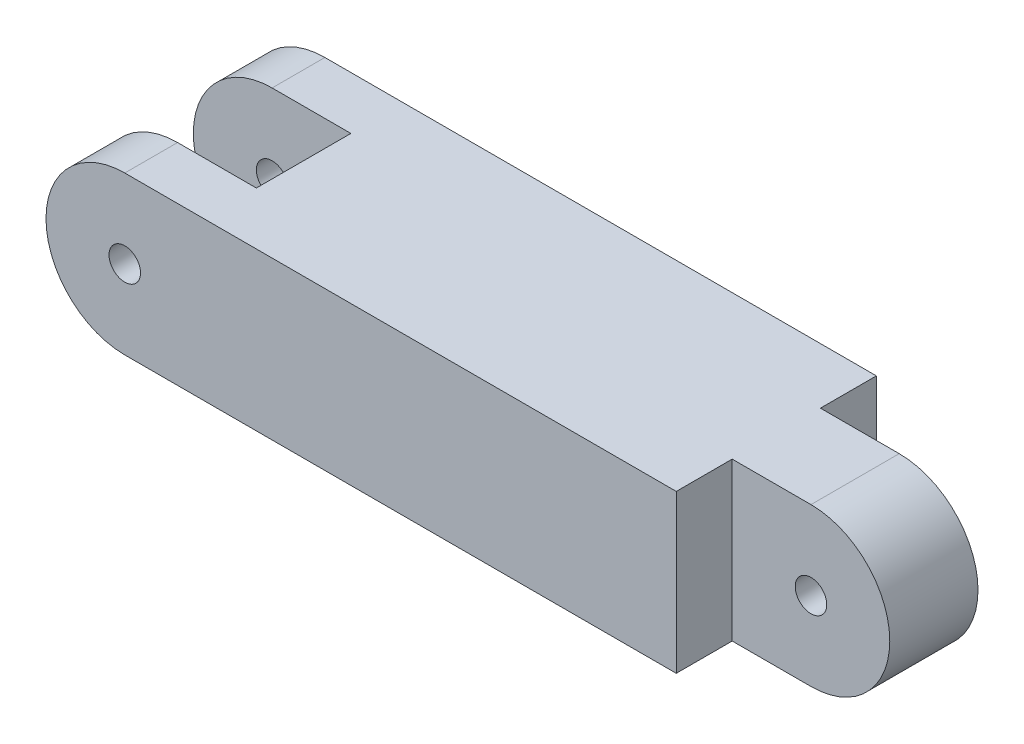
ISO-10303-21;
HEADER;
FILE_DESCRIPTION(('STEP AP214'),'2;1');
FILE_NAME('part.step','',(''),(''),'','','');
FILE_SCHEMA(('AUTOMOTIVE_DESIGN { 1 0 10303 214 1 1 1 1 }'));
ENDSEC;
DATA;
#1=APPLICATION_CONTEXT('core data for automotive mechanical design processes');
#2=APPLICATION_PROTOCOL_DEFINITION('international standard','automotive_design',2000,#1);
#3=PRODUCT_CONTEXT('',#1,'mechanical');
#4=PRODUCT('Part','Part','',(#3));
#5=PRODUCT_RELATED_PRODUCT_CATEGORY('part','',(#4));
#6=PRODUCT_DEFINITION_FORMATION('','',#4);
#7=PRODUCT_DEFINITION_CONTEXT('part definition',#1,'design');
#8=PRODUCT_DEFINITION('design','',#6,#7);
#9=PRODUCT_DEFINITION_SHAPE('','',#8);
#10=(LENGTH_UNIT() NAMED_UNIT(*) SI_UNIT(.MILLI.,.METRE.));
#11=(NAMED_UNIT(*) PLANE_ANGLE_UNIT() SI_UNIT($,.RADIAN.));
#12=(NAMED_UNIT(*) SI_UNIT($,.STERADIAN.) SOLID_ANGLE_UNIT());
#13=UNCERTAINTY_MEASURE_WITH_UNIT(LENGTH_MEASURE(1.E-05),#10,'distance_accuracy_value','');
#14=(GEOMETRIC_REPRESENTATION_CONTEXT(3) GLOBAL_UNCERTAINTY_ASSIGNED_CONTEXT((#13)) GLOBAL_UNIT_ASSIGNED_CONTEXT((#10,
#11,#12)) REPRESENTATION_CONTEXT('',''));
#15=CARTESIAN_POINT('',(0.,0.,0.));
#16=DIRECTION('',(0.,0.,1.));
#17=DIRECTION('',(1.,0.,0.));
#18=AXIS2_PLACEMENT_3D('',#15,#16,#17);
#19=CARTESIAN_POINT('',(0.,-5.,6.35));
#20=DIRECTION('',(0.,1.,0.));
#21=DIRECTION('',(0.,0.,1.));
#22=AXIS2_PLACEMENT_3D('',#19,#20,#21);
#23=PLANE('',#22);
#24=DIRECTION('',(1.,0.,0.));
#25=VECTOR('',#24,1.);
#26=CARTESIAN_POINT('',(-399980.,-4.99999999999545,-3.));
#27=LINE('',#26,#25);
#28=CARTESIAN_POINT('',(0.,-4.99999999999545,-3.));
#29=VERTEX_POINT('',#28);
#30=CARTESIAN_POINT('',(4.99999999999545,-4.99999999999545,-3.));
#31=VERTEX_POINT('',#30);
#32=EDGE_CURVE('E144',#29,#31,#27,.T.);
#33=ORIENTED_EDGE('',*,*,#32,.F.);
#34=DIRECTION('',(0.,0.,-1.));
#35=VECTOR('',#34,1.);
#36=CARTESIAN_POINT('',(0.,-5.,6.35));
#37=LINE('',#36,#35);
#38=CARTESIAN_POINT('',(0.,-5.,-6.35));
#39=VERTEX_POINT('',#38);
#40=EDGE_CURVE('E50',#29,#39,#37,.T.);
#41=ORIENTED_EDGE('',*,*,#40,.T.);
#42=DIRECTION('',(1.,0.,0.));
#43=VECTOR('',#42,1.);
#44=CARTESIAN_POINT('',(0.,-5.,-6.35));
#45=LINE('',#44,#43);
#46=CARTESIAN_POINT('',(35.,-5.,-6.35));
#47=VERTEX_POINT('',#46);
#48=EDGE_CURVE('E228',#39,#47,#45,.T.);
#49=ORIENTED_EDGE('',*,*,#48,.T.);
#50=DIRECTION('',(0.,0.,-1.));
#51=VECTOR('',#50,1.);
#52=CARTESIAN_POINT('',(35.,-5.,14.142135623731));
#53=LINE('',#52,#51);
#54=CARTESIAN_POINT('',(35.,-5.,-2.8));
#55=VERTEX_POINT('',#54);
#56=EDGE_CURVE('E66',#55,#47,#53,.T.);
#57=ORIENTED_EDGE('',*,*,#56,.F.);
#58=DIRECTION('',(1.,0.,0.));
#59=VECTOR('',#58,1.);
#60=CARTESIAN_POINT('',(35.,-5.,-2.8));
#61=LINE('',#60,#59);
#62=CARTESIAN_POINT('',(40.,-5.,-2.8));
#63=VERTEX_POINT('',#62);
#64=EDGE_CURVE('E174',#55,#63,#61,.T.);
#65=ORIENTED_EDGE('',*,*,#64,.T.);
#66=DIRECTION('',(0.,0.,-1.));
#67=VECTOR('',#66,1.);
#68=CARTESIAN_POINT('',(40.,-5.,6.35));
#69=LINE('',#68,#67);
#70=CARTESIAN_POINT('',(40.,-5.,2.8));
#71=VERTEX_POINT('',#70);
#72=EDGE_CURVE('E238',#71,#63,#69,.T.);
#73=ORIENTED_EDGE('',*,*,#72,.F.);
#74=DIRECTION('',(-1.,0.,0.));
#75=VECTOR('',#74,1.);
#76=CARTESIAN_POINT('',(35.,-5.,2.8));
#77=LINE('',#76,#75);
#78=CARTESIAN_POINT('',(35.,-5.,2.8));
#79=VERTEX_POINT('',#78);
#80=EDGE_CURVE('E192',#71,#79,#77,.T.);
#81=ORIENTED_EDGE('',*,*,#80,.T.);
#82=DIRECTION('',(0.,0.,1.));
#83=VECTOR('',#82,1.);
#84=CARTESIAN_POINT('',(35.,-5.,-14.142135623731));
#85=LINE('',#84,#83);
#86=CARTESIAN_POINT('',(35.,-5.,6.35));
#87=VERTEX_POINT('',#86);
#88=EDGE_CURVE('E196',#79,#87,#85,.T.);
#89=ORIENTED_EDGE('',*,*,#88,.T.);
#90=DIRECTION('',(1.,0.,0.));
#91=VECTOR('',#90,1.);
#92=CARTESIAN_POINT('',(0.,-5.,6.35));
#93=LINE('',#92,#91);
#94=CARTESIAN_POINT('',(0.,-5.,6.35));
#95=VERTEX_POINT('',#94);
#96=EDGE_CURVE('E220',#95,#87,#93,.T.);
#97=ORIENTED_EDGE('',*,*,#96,.F.);
#98=CARTESIAN_POINT('',(0.,-5.,3.));
#99=VERTEX_POINT('',#98);
#100=EDGE_CURVE('E12',#95,#99,#37,.T.);
#101=ORIENTED_EDGE('',*,*,#100,.T.);
#102=DIRECTION('',(1.,0.,0.));
#103=VECTOR('',#102,1.);
#104=CARTESIAN_POINT('',(-399980.,-4.99999999999545,3.));
#105=LINE('',#104,#103);
#106=CARTESIAN_POINT('',(4.99999999999545,-4.99999999999545,3.));
#107=VERTEX_POINT('',#106);
#108=EDGE_CURVE('E58',#99,#107,#105,.T.);
#109=ORIENTED_EDGE('',*,*,#108,.T.);
#110=DIRECTION('',(0.,0.,1.));
#111=VECTOR('',#110,1.);
#112=CARTESIAN_POINT('',(4.99999999999545,-4.99999999999545,-3.));
#113=LINE('',#112,#111);
#114=EDGE_CURVE('E143',#31,#107,#113,.T.);
#115=ORIENTED_EDGE('',*,*,#114,.F.);
#116=EDGE_LOOP('',(#33,#41,#49,#57,#65,#73,#81,#89,#97,#101,#109,#115));
#117=FACE_BOUND('',#116,.T.);
#118=ADVANCED_FACE('F41',(#117),#23,.F.);
#119=CARTESIAN_POINT('',(0.,5.,6.35));
#120=DIRECTION('',(0.,-1.,0.));
#121=DIRECTION('',(0.,0.,-1.));
#122=AXIS2_PLACEMENT_3D('',#119,#120,#121);
#123=PLANE('',#122);
#124=DIRECTION('',(-1.,0.,0.));
#125=VECTOR('',#124,1.);
#126=CARTESIAN_POINT('',(-399980.,5.00000000056389,-3.));
#127=LINE('',#126,#125);
#128=CARTESIAN_POINT('',(4.99999999999545,5.0000000000088,-3.));
#129=VERTEX_POINT('',#128);
#130=CARTESIAN_POINT('',(0.,5.,-3.));
#131=VERTEX_POINT('',#130);
#132=EDGE_CURVE('E149',#129,#131,#127,.T.);
#133=ORIENTED_EDGE('',*,*,#132,.F.);
#134=DIRECTION('',(0.,0.,1.));
#135=VECTOR('',#134,1.);
#136=CARTESIAN_POINT('',(4.99999999999545,5.0000000000088,-3.));
#137=LINE('',#136,#135);
#138=CARTESIAN_POINT('',(4.99999999999545,5.0000000000088,3.));
#139=VERTEX_POINT('',#138);
#140=EDGE_CURVE('E134',#129,#139,#137,.T.);
#141=ORIENTED_EDGE('',*,*,#140,.T.);
#142=DIRECTION('',(-1.,0.,0.));
#143=VECTOR('',#142,1.);
#144=CARTESIAN_POINT('',(-399980.,5.00000000056389,3.));
#145=LINE('',#144,#143);
#146=CARTESIAN_POINT('',(0.,5.,3.));
#147=VERTEX_POINT('',#146);
#148=EDGE_CURVE('E164',#139,#147,#145,.T.);
#149=ORIENTED_EDGE('',*,*,#148,.T.);
#150=DIRECTION('',(0.,0.,-1.));
#151=VECTOR('',#150,1.);
#152=CARTESIAN_POINT('',(0.,5.,6.35));
#153=LINE('',#152,#151);
#154=CARTESIAN_POINT('',(0.,5.,6.35));
#155=VERTEX_POINT('',#154);
#156=EDGE_CURVE('E232',#155,#147,#153,.T.);
#157=ORIENTED_EDGE('',*,*,#156,.F.);
#158=DIRECTION('',(-1.,0.,0.));
#159=VECTOR('',#158,1.);
#160=CARTESIAN_POINT('',(0.,5.,6.35));
#161=LINE('',#160,#159);
#162=CARTESIAN_POINT('',(35.,5.,6.35));
#163=VERTEX_POINT('',#162);
#164=EDGE_CURVE('E224',#163,#155,#161,.T.);
#165=ORIENTED_EDGE('',*,*,#164,.F.);
#166=DIRECTION('',(0.,0.,1.));
#167=VECTOR('',#166,1.);
#168=CARTESIAN_POINT('',(35.,5.,-14.142135623731));
#169=LINE('',#168,#167);
#170=CARTESIAN_POINT('',(35.,5.,2.8));
#171=VERTEX_POINT('',#170);
#172=EDGE_CURVE('E204',#171,#163,#169,.T.);
#173=ORIENTED_EDGE('',*,*,#172,.F.);
#174=DIRECTION('',(1.,0.,0.));
#175=VECTOR('',#174,1.);
#176=CARTESIAN_POINT('',(40.,5.,2.8));
#177=LINE('',#176,#175);
#178=CARTESIAN_POINT('',(40.,5.,2.8));
#179=VERTEX_POINT('',#178);
#180=EDGE_CURVE('E199',#171,#179,#177,.T.);
#181=ORIENTED_EDGE('',*,*,#180,.T.);
#182=DIRECTION('',(0.,0.,-1.));
#183=VECTOR('',#182,1.);
#184=CARTESIAN_POINT('',(40.,5.,6.35));
#185=LINE('',#184,#183);
#186=CARTESIAN_POINT('',(40.,5.,-2.8));
#187=VERTEX_POINT('',#186);
#188=EDGE_CURVE('E235',#179,#187,#185,.T.);
#189=ORIENTED_EDGE('',*,*,#188,.T.);
#190=DIRECTION('',(-1.,0.,0.));
#191=VECTOR('',#190,1.);
#192=CARTESIAN_POINT('',(40.,5.,-2.8));
#193=LINE('',#192,#191);
#194=CARTESIAN_POINT('',(35.,5.,-2.8));
#195=VERTEX_POINT('',#194);
#196=EDGE_CURVE('E180',#187,#195,#193,.T.);
#197=ORIENTED_EDGE('',*,*,#196,.T.);
#198=DIRECTION('',(0.,0.,-1.));
#199=VECTOR('',#198,1.);
#200=CARTESIAN_POINT('',(35.,5.,14.142135623731));
#201=LINE('',#200,#199);
#202=CARTESIAN_POINT('',(35.,5.,-6.35));
#203=VERTEX_POINT('',#202);
#204=EDGE_CURVE('E173',#195,#203,#201,.T.);
#205=ORIENTED_EDGE('',*,*,#204,.T.);
#206=DIRECTION('',(-1.,0.,0.));
#207=VECTOR('',#206,1.);
#208=CARTESIAN_POINT('',(0.,5.,-6.35));
#209=LINE('',#208,#207);
#210=CARTESIAN_POINT('',(0.,5.,-6.35));
#211=VERTEX_POINT('',#210);
#212=EDGE_CURVE('E221',#203,#211,#209,.T.);
#213=ORIENTED_EDGE('',*,*,#212,.T.);
#214=EDGE_CURVE('E157',#131,#211,#153,.T.);
#215=ORIENTED_EDGE('',*,*,#214,.F.);
#216=EDGE_LOOP('',(#133,#141,#149,#157,#165,#173,#181,#189,#197,#205,#213,#215));
#217=FACE_BOUND('',#216,.T.);
#218=ADVANCED_FACE('F155',(#217),#123,.F.);
#219=CARTESIAN_POINT('',(0.,0.,6.35));
#220=DIRECTION('',(0.,0.,-1.));
#221=DIRECTION('',(-1.,0.,0.));
#222=AXIS2_PLACEMENT_3D('',#219,#220,#221);
#223=CYLINDRICAL_SURFACE('',#222,5.);
#224=CARTESIAN_POINT('',(0.,0.,-3.));
#225=DIRECTION('',(0.,0.,1.));
#226=DIRECTION('',(1.,0.,0.));
#227=AXIS2_PLACEMENT_3D('',#224,#225,#226);
#228=CIRCLE('',#227,5.);
#229=EDGE_CURVE('E158',#131,#29,#228,.T.);
#230=ORIENTED_EDGE('',*,*,#229,.F.);
#231=ORIENTED_EDGE('',*,*,#214,.T.);
#232=CARTESIAN_POINT('',(0.,0.,-6.35));
#233=DIRECTION('',(0.,0.,1.));
#234=DIRECTION('',(1.,0.,0.));
#235=AXIS2_PLACEMENT_3D('',#232,#233,#234);
#236=CIRCLE('',#235,5.);
#237=EDGE_CURVE('E216',#211,#39,#236,.T.);
#238=ORIENTED_EDGE('',*,*,#237,.T.);
#239=ORIENTED_EDGE('',*,*,#40,.F.);
#240=EDGE_LOOP('',(#230,#231,#238,#239));
#241=FACE_BOUND('',#240,.T.);
#242=ADVANCED_FACE('F251',(#241),#223,.T.);
#243=CARTESIAN_POINT('',(0.,0.,-9.17842712474619));
#244=DIRECTION('',(0.,0.,1.));
#245=DIRECTION('',(1.,0.,0.));
#246=AXIS2_PLACEMENT_3D('',#243,#244,#245);
#247=CYLINDRICAL_SURFACE('',#246,1.);
#248=CARTESIAN_POINT('',(0.,0.,-6.35));
#249=DIRECTION('',(0.,0.,1.));
#250=DIRECTION('',(1.,0.,0.));
#251=AXIS2_PLACEMENT_3D('',#248,#249,#250);
#252=CIRCLE('',#251,1.);
#253=CARTESIAN_POINT('',(1.,0.,-6.35));
#254=VERTEX_POINT('',#253);
#255=EDGE_CURVE('E210',#254,#254,#252,.F.);
#256=ORIENTED_EDGE('',*,*,#255,.T.);
#257=EDGE_LOOP('',(#256));
#258=FACE_BOUND('',#257,.T.);
#259=CARTESIAN_POINT('',(0.,0.,-3.));
#260=DIRECTION('',(0.,0.,1.));
#261=DIRECTION('',(1.,0.,0.));
#262=AXIS2_PLACEMENT_3D('',#259,#260,#261);
#263=CIRCLE('',#262,1.);
#264=CARTESIAN_POINT('',(1.,0.,-3.));
#265=VERTEX_POINT('',#264);
#266=EDGE_CURVE('E45',#265,#265,#263,.F.);
#267=ORIENTED_EDGE('',*,*,#266,.F.);
#268=EDGE_LOOP('',(#267));
#269=FACE_BOUND('',#268,.T.);
#270=ADVANCED_FACE('F248',(#258,#269),#247,.F.);
#271=CARTESIAN_POINT('',(0.,0.,-6.35));
#272=DIRECTION('',(0.,0.,1.));
#273=DIRECTION('',(1.,0.,0.));
#274=AXIS2_PLACEMENT_3D('',#271,#272,#273);
#275=PLANE('',#274);
#276=ORIENTED_EDGE('',*,*,#255,.F.);
#277=EDGE_LOOP('',(#276));
#278=FACE_BOUND('',#277,.T.);
#279=DIRECTION('',(0.,-1.,0.));
#280=VECTOR('',#279,1.);
#281=CARTESIAN_POINT('',(35.,5.,-6.35));
#282=LINE('',#281,#280);
#283=EDGE_CURVE('E171',#203,#47,#282,.T.);
#284=ORIENTED_EDGE('',*,*,#283,.T.);
#285=ORIENTED_EDGE('',*,*,#48,.F.);
#286=ORIENTED_EDGE('',*,*,#237,.F.);
#287=ORIENTED_EDGE('',*,*,#212,.F.);
#288=EDGE_LOOP('',(#284,#285,#286,#287));
#289=FACE_BOUND('',#288,.T.);
#290=ADVANCED_FACE('F250',(#278,#289),#275,.F.);
#291=CARTESIAN_POINT('',(40.,0.,6.35));
#292=DIRECTION('',(0.,0.,-1.));
#293=DIRECTION('',(-1.,0.,0.));
#294=AXIS2_PLACEMENT_3D('',#291,#292,#293);
#295=CYLINDRICAL_SURFACE('',#294,5.);
#296=ORIENTED_EDGE('',*,*,#72,.T.);
#297=CARTESIAN_POINT('',(40.,0.,-2.8));
#298=DIRECTION('',(0.,0.,1.));
#299=DIRECTION('',(1.,0.,0.));
#300=AXIS2_PLACEMENT_3D('',#297,#298,#299);
#301=CIRCLE('',#300,5.);
#302=EDGE_CURVE('E183',#63,#187,#301,.T.);
#303=ORIENTED_EDGE('',*,*,#302,.T.);
#304=ORIENTED_EDGE('',*,*,#188,.F.);
#305=CARTESIAN_POINT('',(40.,0.,2.8));
#306=DIRECTION('',(0.,0.,1.));
#307=DIRECTION('',(1.,0.,0.));
#308=AXIS2_PLACEMENT_3D('',#305,#306,#307);
#309=CIRCLE('',#308,5.);
#310=EDGE_CURVE('E195',#179,#71,#309,.F.);
#311=ORIENTED_EDGE('',*,*,#310,.T.);
#312=EDGE_LOOP('',(#296,#303,#304,#311));
#313=FACE_BOUND('',#312,.T.);
#314=ADVANCED_FACE('F260',(#313),#295,.T.);
#315=CARTESIAN_POINT('',(40.,0.,-9.17842712474619));
#316=DIRECTION('',(0.,0.,1.));
#317=DIRECTION('',(1.,0.,0.));
#318=AXIS2_PLACEMENT_3D('',#315,#316,#317);
#319=CYLINDRICAL_SURFACE('',#318,0.999999999999998);
#320=CARTESIAN_POINT('',(40.,0.,-2.8));
#321=DIRECTION('',(0.,0.,1.));
#322=DIRECTION('',(1.,0.,0.));
#323=AXIS2_PLACEMENT_3D('',#320,#321,#322);
#324=CIRCLE('',#323,0.999999999999998);
#325=CARTESIAN_POINT('',(41.,0.,-2.8));
#326=VERTEX_POINT('',#325);
#327=EDGE_CURVE('E177',#326,#326,#324,.F.);
#328=ORIENTED_EDGE('',*,*,#327,.T.);
#329=EDGE_LOOP('',(#328));
#330=FACE_BOUND('',#329,.T.);
#331=CARTESIAN_POINT('',(40.,0.,2.8));
#332=DIRECTION('',(0.,0.,1.));
#333=DIRECTION('',(1.,0.,0.));
#334=AXIS2_PLACEMENT_3D('',#331,#332,#333);
#335=CIRCLE('',#334,0.999999999999998);
#336=CARTESIAN_POINT('',(41.,0.,2.8));
#337=VERTEX_POINT('',#336);
#338=EDGE_CURVE('E209',#337,#337,#335,.F.);
#339=ORIENTED_EDGE('',*,*,#338,.F.);
#340=EDGE_LOOP('',(#339));
#341=FACE_BOUND('',#340,.T.);
#342=ADVANCED_FACE('F278',(#330,#341),#319,.F.);
#343=ORIENTED_EDGE('',*,*,#156,.T.);
#344=CARTESIAN_POINT('',(0.,0.,3.));
#345=DIRECTION('',(0.,0.,1.));
#346=DIRECTION('',(1.,0.,0.));
#347=AXIS2_PLACEMENT_3D('',#344,#345,#346);
#348=CIRCLE('',#347,5.);
#349=EDGE_CURVE('E166',#147,#99,#348,.T.);
#350=ORIENTED_EDGE('',*,*,#349,.T.);
#351=ORIENTED_EDGE('',*,*,#100,.F.);
#352=CARTESIAN_POINT('',(0.,0.,6.35));
#353=DIRECTION('',(0.,0.,1.));
#354=DIRECTION('',(1.,0.,0.));
#355=AXIS2_PLACEMENT_3D('',#352,#353,#354);
#356=CIRCLE('',#355,5.);
#357=EDGE_CURVE('E217',#155,#95,#356,.T.);
#358=ORIENTED_EDGE('',*,*,#357,.F.);
#359=EDGE_LOOP('',(#343,#350,#351,#358));
#360=FACE_BOUND('',#359,.T.);
#361=ADVANCED_FACE('F43',(#360),#223,.T.);
#362=CARTESIAN_POINT('',(0.,0.,6.35));
#363=DIRECTION('',(0.,0.,1.));
#364=DIRECTION('',(1.,0.,0.));
#365=AXIS2_PLACEMENT_3D('',#362,#363,#364);
#366=PLANE('',#365);
#367=DIRECTION('',(0.,-1.,0.));
#368=VECTOR('',#367,1.);
#369=CARTESIAN_POINT('',(35.,5.,6.35));
#370=LINE('',#369,#368);
#371=EDGE_CURVE('E191',#163,#87,#370,.T.);
#372=ORIENTED_EDGE('',*,*,#371,.F.);
#373=ORIENTED_EDGE('',*,*,#164,.T.);
#374=ORIENTED_EDGE('',*,*,#357,.T.);
#375=ORIENTED_EDGE('',*,*,#96,.T.);
#376=EDGE_LOOP('',(#372,#373,#374,#375));
#377=FACE_BOUND('',#376,.T.);
#378=CARTESIAN_POINT('',(0.,0.,6.35));
#379=DIRECTION('',(0.,0.,1.));
#380=DIRECTION('',(1.,0.,0.));
#381=AXIS2_PLACEMENT_3D('',#378,#379,#380);
#382=CIRCLE('',#381,1.);
#383=CARTESIAN_POINT('',(1.,0.,6.35));
#384=VERTEX_POINT('',#383);
#385=EDGE_CURVE('E213',#384,#384,#382,.T.);
#386=ORIENTED_EDGE('',*,*,#385,.F.);
#387=EDGE_LOOP('',(#386));
#388=FACE_BOUND('',#387,.T.);
#389=ADVANCED_FACE('F268',(#377,#388),#366,.T.);
#390=CARTESIAN_POINT('',(0.,0.,3.));
#391=DIRECTION('',(0.,0.,1.));
#392=DIRECTION('',(1.,0.,0.));
#393=AXIS2_PLACEMENT_3D('',#390,#391,#392);
#394=CIRCLE('',#393,1.);
#395=CARTESIAN_POINT('',(1.,0.,3.));
#396=VERTEX_POINT('',#395);
#397=EDGE_CURVE('E169',#396,#396,#394,.F.);
#398=ORIENTED_EDGE('',*,*,#397,.T.);
#399=EDGE_LOOP('',(#398));
#400=FACE_BOUND('',#399,.T.);
#401=ORIENTED_EDGE('',*,*,#385,.T.);
#402=EDGE_LOOP('',(#401));
#403=FACE_BOUND('',#402,.T.);
#404=ADVANCED_FACE('F254',(#400,#403),#247,.F.);
#405=CARTESIAN_POINT('',(0.,0.,2.8));
#406=DIRECTION('',(0.,0.,1.));
#407=DIRECTION('',(1.,0.,0.));
#408=AXIS2_PLACEMENT_3D('',#405,#406,#407);
#409=PLANE('',#408);
#410=ORIENTED_EDGE('',*,*,#180,.F.);
#411=DIRECTION('',(0.,1.,0.));
#412=VECTOR('',#411,1.);
#413=CARTESIAN_POINT('',(35.,5.,2.8));
#414=LINE('',#413,#412);
#415=EDGE_CURVE('E202',#79,#171,#414,.T.);
#416=ORIENTED_EDGE('',*,*,#415,.F.);
#417=ORIENTED_EDGE('',*,*,#80,.F.);
#418=ORIENTED_EDGE('',*,*,#310,.F.);
#419=EDGE_LOOP('',(#410,#416,#417,#418));
#420=FACE_BOUND('',#419,.T.);
#421=ORIENTED_EDGE('',*,*,#338,.T.);
#422=EDGE_LOOP('',(#421));
#423=FACE_BOUND('',#422,.T.);
#424=ADVANCED_FACE('F267',(#420,#423),#409,.T.);
#425=CARTESIAN_POINT('',(35.,5.,-14.142135623731));
#426=DIRECTION('',(-1.,0.,0.));
#427=DIRECTION('',(0.,0.,1.));
#428=AXIS2_PLACEMENT_3D('',#425,#426,#427);
#429=PLANE('',#428);
#430=ORIENTED_EDGE('',*,*,#415,.T.);
#431=ORIENTED_EDGE('',*,*,#172,.T.);
#432=ORIENTED_EDGE('',*,*,#371,.T.);
#433=ORIENTED_EDGE('',*,*,#88,.F.);
#434=EDGE_LOOP('',(#430,#431,#432,#433));
#435=FACE_BOUND('',#434,.T.);
#436=ADVANCED_FACE('F298',(#435),#429,.F.);
#437=CARTESIAN_POINT('',(0.,0.,-2.8));
#438=DIRECTION('',(0.,0.,1.));
#439=DIRECTION('',(1.,0.,0.));
#440=AXIS2_PLACEMENT_3D('',#437,#438,#439);
#441=PLANE('',#440);
#442=ORIENTED_EDGE('',*,*,#302,.F.);
#443=ORIENTED_EDGE('',*,*,#64,.F.);
#444=DIRECTION('',(0.,-1.,0.));
#445=VECTOR('',#444,1.);
#446=CARTESIAN_POINT('',(35.,5.,-2.8));
#447=LINE('',#446,#445);
#448=EDGE_CURVE('E178',#195,#55,#447,.T.);
#449=ORIENTED_EDGE('',*,*,#448,.F.);
#450=ORIENTED_EDGE('',*,*,#196,.F.);
#451=EDGE_LOOP('',(#442,#443,#449,#450));
#452=FACE_BOUND('',#451,.T.);
#453=ORIENTED_EDGE('',*,*,#327,.F.);
#454=EDGE_LOOP('',(#453));
#455=FACE_BOUND('',#454,.T.);
#456=ADVANCED_FACE('F304',(#452,#455),#441,.F.);
#457=CARTESIAN_POINT('',(35.,5.,14.142135623731));
#458=DIRECTION('',(1.,0.,0.));
#459=DIRECTION('',(0.,0.,-1.));
#460=AXIS2_PLACEMENT_3D('',#457,#458,#459);
#461=PLANE('',#460);
#462=ORIENTED_EDGE('',*,*,#448,.T.);
#463=ORIENTED_EDGE('',*,*,#56,.T.);
#464=ORIENTED_EDGE('',*,*,#283,.F.);
#465=ORIENTED_EDGE('',*,*,#204,.F.);
#466=EDGE_LOOP('',(#462,#463,#464,#465));
#467=FACE_BOUND('',#466,.T.);
#468=ADVANCED_FACE('F312',(#467),#461,.T.);
#469=CARTESIAN_POINT('',(0.,0.,-3.));
#470=DIRECTION('',(0.,0.,1.));
#471=DIRECTION('',(1.,0.,0.));
#472=AXIS2_PLACEMENT_3D('',#469,#470,#471);
#473=PLANE('',#472);
#474=DIRECTION('',(0.,1.,0.));
#475=VECTOR('',#474,1.);
#476=CARTESIAN_POINT('',(5.0000000000523,-291594.5,-3.));
#477=LINE('',#476,#475);
#478=EDGE_CURVE('E137',#31,#129,#477,.T.);
#479=ORIENTED_EDGE('',*,*,#478,.T.);
#480=ORIENTED_EDGE('',*,*,#132,.T.);
#481=ORIENTED_EDGE('',*,*,#229,.T.);
#482=ORIENTED_EDGE('',*,*,#32,.T.);
#483=EDGE_LOOP('',(#479,#480,#481,#482));
#484=FACE_BOUND('',#483,.T.);
#485=ORIENTED_EDGE('',*,*,#266,.T.);
#486=EDGE_LOOP('',(#485));
#487=FACE_BOUND('',#486,.T.);
#488=ADVANCED_FACE('F147',(#484,#487),#473,.T.);
#489=CARTESIAN_POINT('',(0.,0.,3.));
#490=DIRECTION('',(0.,0.,1.));
#491=DIRECTION('',(1.,0.,0.));
#492=AXIS2_PLACEMENT_3D('',#489,#490,#491);
#493=PLANE('',#492);
#494=DIRECTION('',(0.,1.,0.));
#495=VECTOR('',#494,1.);
#496=CARTESIAN_POINT('',(5.0000000000523,-291594.5,3.));
#497=LINE('',#496,#495);
#498=EDGE_CURVE('E139',#107,#139,#497,.T.);
#499=ORIENTED_EDGE('',*,*,#498,.F.);
#500=ORIENTED_EDGE('',*,*,#108,.F.);
#501=ORIENTED_EDGE('',*,*,#349,.F.);
#502=ORIENTED_EDGE('',*,*,#148,.F.);
#503=EDGE_LOOP('',(#499,#500,#501,#502));
#504=FACE_BOUND('',#503,.T.);
#505=ORIENTED_EDGE('',*,*,#397,.F.);
#506=EDGE_LOOP('',(#505));
#507=FACE_BOUND('',#506,.T.);
#508=ADVANCED_FACE('F318',(#504,#507),#493,.F.);
#509=CARTESIAN_POINT('',(5.0000000000523,-291594.5,-3.));
#510=DIRECTION('',(1.,0.,0.));
#511=DIRECTION('',(0.,1.,0.));
#512=AXIS2_PLACEMENT_3D('',#509,#510,#511);
#513=PLANE('',#512);
#514=ORIENTED_EDGE('',*,*,#498,.T.);
#515=ORIENTED_EDGE('',*,*,#140,.F.);
#516=ORIENTED_EDGE('',*,*,#478,.F.);
#517=ORIENTED_EDGE('',*,*,#114,.T.);
#518=EDGE_LOOP('',(#514,#515,#516,#517));
#519=FACE_BOUND('',#518,.T.);
#520=ADVANCED_FACE('F136',(#519),#513,.F.);
#521=CLOSED_SHELL('',(#118,#218,#242,#270,#290,#314,#342,#361,#389,#404,#424,#436,#456,#468,
#488,#508,#520));
#522=MANIFOLD_SOLID_BREP('B2',#521);
#523=ADVANCED_BREP_SHAPE_REPRESENTATION('',(#18,#522),#14);
#524=SHAPE_DEFINITION_REPRESENTATION(#9,#523);
ENDSEC;
END-ISO-10303-21;
